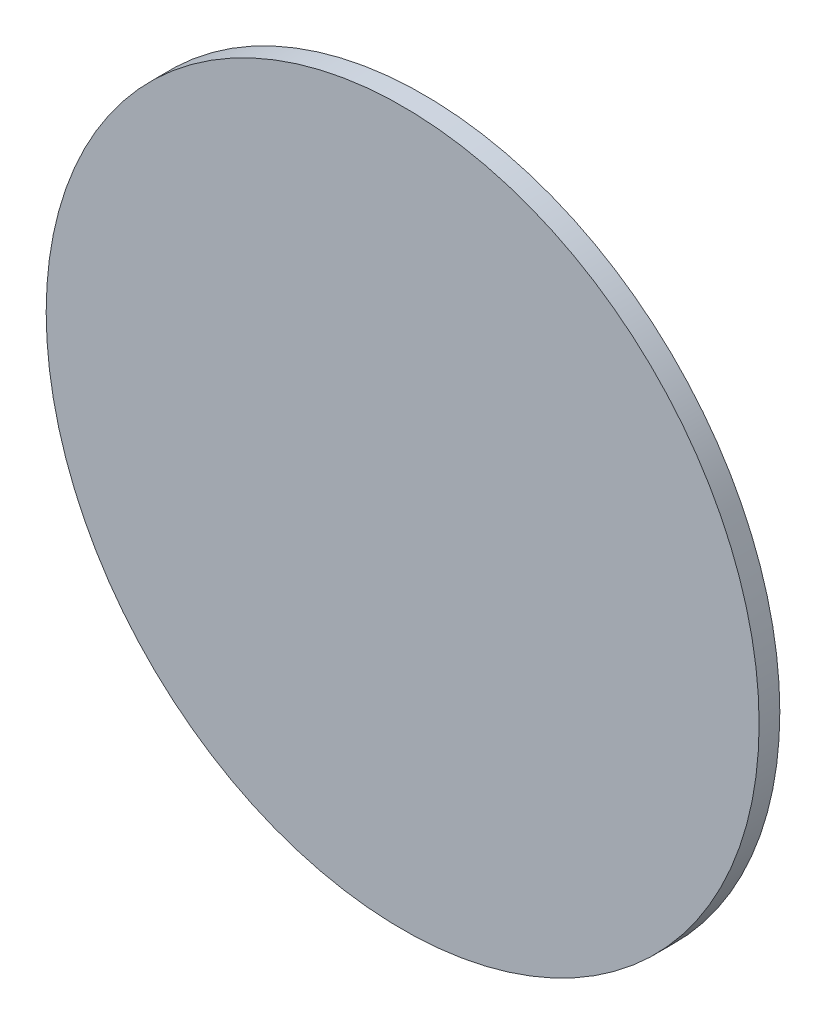
ISO-10303-21;
HEADER;
FILE_DESCRIPTION(('STEP AP214'),'2;1');
FILE_NAME('part.step','',(''),(''),'','','');
FILE_SCHEMA(('AUTOMOTIVE_DESIGN { 1 0 10303 214 1 1 1 1 }'));
ENDSEC;
DATA;
#1=APPLICATION_CONTEXT('core data for automotive mechanical design processes');
#2=APPLICATION_PROTOCOL_DEFINITION('international standard','automotive_design',2000,#1);
#3=PRODUCT_CONTEXT('',#1,'mechanical');
#4=PRODUCT('Part','Part','',(#3));
#5=PRODUCT_RELATED_PRODUCT_CATEGORY('part','',(#4));
#6=PRODUCT_DEFINITION_FORMATION('','',#4);
#7=PRODUCT_DEFINITION_CONTEXT('part definition',#1,'design');
#8=PRODUCT_DEFINITION('design','',#6,#7);
#9=PRODUCT_DEFINITION_SHAPE('','',#8);
#10=(LENGTH_UNIT() NAMED_UNIT(*) SI_UNIT(.MILLI.,.METRE.));
#11=(NAMED_UNIT(*) PLANE_ANGLE_UNIT() SI_UNIT($,.RADIAN.));
#12=(NAMED_UNIT(*) SI_UNIT($,.STERADIAN.) SOLID_ANGLE_UNIT());
#13=UNCERTAINTY_MEASURE_WITH_UNIT(LENGTH_MEASURE(1.E-05),#10,'distance_accuracy_value','');
#14=(GEOMETRIC_REPRESENTATION_CONTEXT(3) GLOBAL_UNCERTAINTY_ASSIGNED_CONTEXT((#13)) GLOBAL_UNIT_ASSIGNED_CONTEXT((#10,
#11,#12)) REPRESENTATION_CONTEXT('',''));
#15=CARTESIAN_POINT('',(0.,0.,0.));
#16=DIRECTION('',(0.,0.,1.));
#17=DIRECTION('',(1.,0.,0.));
#18=AXIS2_PLACEMENT_3D('',#15,#16,#17);
#19=CARTESIAN_POINT('',(0.,0.,10.));
#20=DIRECTION('',(0.,0.,-1.));
#21=DIRECTION('',(-1.,0.,0.));
#22=AXIS2_PLACEMENT_3D('',#19,#20,#21);
#23=CYLINDRICAL_SURFACE('',#22,172.204);
#24=CARTESIAN_POINT('',(0.,0.,10.));
#25=DIRECTION('',(0.,0.,1.));
#26=DIRECTION('',(1.,0.,0.));
#27=AXIS2_PLACEMENT_3D('',#24,#25,#26);
#28=CIRCLE('',#27,172.204);
#29=CARTESIAN_POINT('',(172.204,0.,10.));
#30=VERTEX_POINT('',#29);
#31=EDGE_CURVE('E10',#30,#30,#28,.T.);
#32=ORIENTED_EDGE('',*,*,#31,.F.);
#33=EDGE_LOOP('',(#32));
#34=FACE_BOUND('',#33,.T.);
#35=CARTESIAN_POINT('',(0.,0.,0.));
#36=DIRECTION('',(0.,0.,1.));
#37=DIRECTION('',(1.,0.,0.));
#38=AXIS2_PLACEMENT_3D('',#35,#36,#37);
#39=CIRCLE('',#38,172.204);
#40=CARTESIAN_POINT('',(172.204,0.,0.));
#41=VERTEX_POINT('',#40);
#42=EDGE_CURVE('E40',#41,#41,#39,.T.);
#43=ORIENTED_EDGE('',*,*,#42,.T.);
#44=EDGE_LOOP('',(#43));
#45=FACE_BOUND('',#44,.T.);
#46=ADVANCED_FACE('F37',(#34,#45),#23,.T.);
#47=CARTESIAN_POINT('',(0.,0.,10.));
#48=DIRECTION('',(0.,0.,1.));
#49=DIRECTION('',(1.,0.,0.));
#50=AXIS2_PLACEMENT_3D('',#47,#48,#49);
#51=PLANE('',#50);
#52=ORIENTED_EDGE('',*,*,#31,.T.);
#53=EDGE_LOOP('',(#52));
#54=FACE_BOUND('',#53,.T.);
#55=ADVANCED_FACE('F54',(#54),#51,.T.);
#56=CARTESIAN_POINT('',(0.,0.,0.));
#57=DIRECTION('',(0.,0.,1.));
#58=DIRECTION('',(1.,0.,0.));
#59=AXIS2_PLACEMENT_3D('',#56,#57,#58);
#60=PLANE('',#59);
#61=ORIENTED_EDGE('',*,*,#42,.F.);
#62=EDGE_LOOP('',(#61));
#63=FACE_BOUND('',#62,.T.);
#64=ADVANCED_FACE('F52',(#63),#60,.F.);
#65=CLOSED_SHELL('',(#46,#55,#64));
#66=MANIFOLD_SOLID_BREP('B2',#65);
#67=ADVANCED_BREP_SHAPE_REPRESENTATION('',(#18,#66),#14);
#68=SHAPE_DEFINITION_REPRESENTATION(#9,#67);
ENDSEC;
END-ISO-10303-21;
